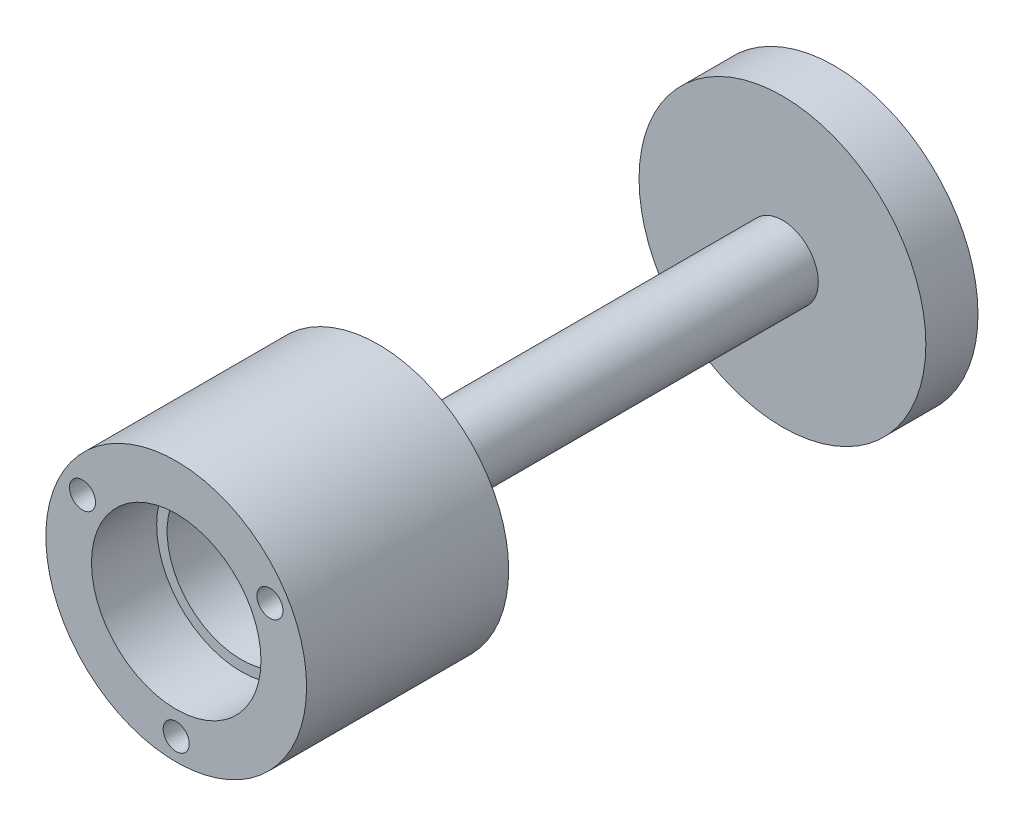
ISO-10303-21;
HEADER;
FILE_DESCRIPTION(('STEP AP214'),'2;1');
FILE_NAME('part.step','',(''),(''),'','','');
FILE_SCHEMA(('AUTOMOTIVE_DESIGN { 1 0 10303 214 1 1 1 1 }'));
ENDSEC;
DATA;
#1=APPLICATION_CONTEXT('core data for automotive mechanical design processes');
#2=APPLICATION_PROTOCOL_DEFINITION('international standard','automotive_design',2000,#1);
#3=PRODUCT_CONTEXT('',#1,'mechanical');
#4=PRODUCT('Part','Part','',(#3));
#5=PRODUCT_RELATED_PRODUCT_CATEGORY('part','',(#4));
#6=PRODUCT_DEFINITION_FORMATION('','',#4);
#7=PRODUCT_DEFINITION_CONTEXT('part definition',#1,'design');
#8=PRODUCT_DEFINITION('design','',#6,#7);
#9=PRODUCT_DEFINITION_SHAPE('','',#8);
#10=(LENGTH_UNIT() NAMED_UNIT(*) SI_UNIT(.MILLI.,.METRE.));
#11=(NAMED_UNIT(*) PLANE_ANGLE_UNIT() SI_UNIT($,.RADIAN.));
#12=(NAMED_UNIT(*) SI_UNIT($,.STERADIAN.) SOLID_ANGLE_UNIT());
#13=UNCERTAINTY_MEASURE_WITH_UNIT(LENGTH_MEASURE(1.E-05),#10,'distance_accuracy_value','');
#14=(GEOMETRIC_REPRESENTATION_CONTEXT(3) GLOBAL_UNCERTAINTY_ASSIGNED_CONTEXT((#13)) GLOBAL_UNIT_ASSIGNED_CONTEXT((#10,
#11,#12)) REPRESENTATION_CONTEXT('',''));
#15=CARTESIAN_POINT('',(0.,0.,0.));
#16=DIRECTION('',(0.,0.,1.));
#17=DIRECTION('',(1.,0.,0.));
#18=AXIS2_PLACEMENT_3D('',#15,#16,#17);
#19=CARTESIAN_POINT('',(0.,0.,31.01));
#20=DIRECTION('',(0.,0.,-1.));
#21=DIRECTION('',(-1.,0.,0.));
#22=AXIS2_PLACEMENT_3D('',#19,#20,#21);
#23=CYLINDRICAL_SURFACE('',#22,2.75);
#24=CARTESIAN_POINT('',(0.,0.,0.));
#25=DIRECTION('',(0.,0.,1.));
#26=DIRECTION('',(1.,0.,0.));
#27=AXIS2_PLACEMENT_3D('',#24,#25,#26);
#28=CIRCLE('',#27,2.75);
#29=CARTESIAN_POINT('',(2.75,0.,0.));
#30=VERTEX_POINT('',#29);
#31=EDGE_CURVE('E46',#30,#30,#28,.T.);
#32=ORIENTED_EDGE('',*,*,#31,.T.);
#33=EDGE_LOOP('',(#32));
#34=FACE_BOUND('',#33,.T.);
#35=CARTESIAN_POINT('',(0.,0.,31.));
#36=DIRECTION('',(0.,0.,1.));
#37=DIRECTION('',(1.,0.,0.));
#38=AXIS2_PLACEMENT_3D('',#35,#36,#37);
#39=CIRCLE('',#38,2.75);
#40=CARTESIAN_POINT('',(2.75,0.,31.));
#41=VERTEX_POINT('',#40);
#42=EDGE_CURVE('E10',#41,#41,#39,.T.);
#43=ORIENTED_EDGE('',*,*,#42,.F.);
#44=EDGE_LOOP('',(#43));
#45=FACE_BOUND('',#44,.T.);
#46=ADVANCED_FACE('F39',(#34,#45),#23,.T.);
#47=CARTESIAN_POINT('',(0.,0.,0.));
#48=DIRECTION('',(0.,0.,-1.));
#49=DIRECTION('',(-1.,0.,0.));
#50=AXIS2_PLACEMENT_3D('',#47,#48,#49);
#51=CYLINDRICAL_SURFACE('',#50,11.);
#52=CARTESIAN_POINT('',(0.,0.,0.));
#53=DIRECTION('',(0.,0.,1.));
#54=DIRECTION('',(1.,0.,0.));
#55=AXIS2_PLACEMENT_3D('',#52,#53,#54);
#56=CIRCLE('',#55,11.);
#57=CARTESIAN_POINT('',(11.,0.,0.));
#58=VERTEX_POINT('',#57);
#59=EDGE_CURVE('E49',#58,#58,#56,.T.);
#60=ORIENTED_EDGE('',*,*,#59,.F.);
#61=EDGE_LOOP('',(#60));
#62=FACE_BOUND('',#61,.T.);
#63=CARTESIAN_POINT('',(0.,0.,-4.));
#64=DIRECTION('',(0.,0.,1.));
#65=DIRECTION('',(1.,0.,0.));
#66=AXIS2_PLACEMENT_3D('',#63,#64,#65);
#67=CIRCLE('',#66,11.);
#68=CARTESIAN_POINT('',(11.,0.,-4.));
#69=VERTEX_POINT('',#68);
#70=EDGE_CURVE('E54',#69,#69,#67,.T.);
#71=ORIENTED_EDGE('',*,*,#70,.T.);
#72=EDGE_LOOP('',(#71));
#73=FACE_BOUND('',#72,.T.);
#74=ADVANCED_FACE('F41',(#62,#73),#51,.T.);
#75=CARTESIAN_POINT('',(0.,0.,0.));
#76=DIRECTION('',(0.,0.,1.));
#77=DIRECTION('',(1.,0.,0.));
#78=AXIS2_PLACEMENT_3D('',#75,#76,#77);
#79=PLANE('',#78);
#80=ORIENTED_EDGE('',*,*,#31,.F.);
#81=EDGE_LOOP('',(#80));
#82=FACE_BOUND('',#81,.T.);
#83=ORIENTED_EDGE('',*,*,#59,.T.);
#84=EDGE_LOOP('',(#83));
#85=FACE_BOUND('',#84,.T.);
#86=ADVANCED_FACE('F171',(#82,#85),#79,.T.);
#87=CARTESIAN_POINT('',(0.,0.,-4.));
#88=DIRECTION('',(0.,0.,1.));
#89=DIRECTION('',(1.,0.,0.));
#90=AXIS2_PLACEMENT_3D('',#87,#88,#89);
#91=PLANE('',#90);
#92=CARTESIAN_POINT('',(7.18801085141084,4.15,-4.));
#93=DIRECTION('',(0.,0.,-1.));
#94=DIRECTION('',(-1.,0.,0.));
#95=AXIS2_PLACEMENT_3D('',#92,#93,#94);
#96=CIRCLE('',#95,1.);
#97=CARTESIAN_POINT('',(6.18801085141084,4.15,-4.));
#98=VERTEX_POINT('',#97);
#99=EDGE_CURVE('E100',#98,#98,#96,.T.);
#100=ORIENTED_EDGE('',*,*,#99,.F.);
#101=EDGE_LOOP('',(#100));
#102=FACE_BOUND('',#101,.T.);
#103=CARTESIAN_POINT('',(-7.18801085141084,4.15,-4.));
#104=DIRECTION('',(0.,0.,-1.));
#105=DIRECTION('',(-1.,0.,0.));
#106=AXIS2_PLACEMENT_3D('',#103,#104,#105);
#107=CIRCLE('',#106,1.);
#108=CARTESIAN_POINT('',(-8.18801085141084,4.15,-4.));
#109=VERTEX_POINT('',#108);
#110=EDGE_CURVE('E94',#109,#109,#107,.T.);
#111=ORIENTED_EDGE('',*,*,#110,.F.);
#112=EDGE_LOOP('',(#111));
#113=FACE_BOUND('',#112,.T.);
#114=CARTESIAN_POINT('',(0.,-8.3,-4.));
#115=DIRECTION('',(0.,0.,-1.));
#116=DIRECTION('',(-1.,0.,0.));
#117=AXIS2_PLACEMENT_3D('',#114,#115,#116);
#118=CIRCLE('',#117,1.);
#119=CARTESIAN_POINT('',(-1.,-8.3,-4.));
#120=VERTEX_POINT('',#119);
#121=EDGE_CURVE('E87',#120,#120,#118,.T.);
#122=ORIENTED_EDGE('',*,*,#121,.F.);
#123=EDGE_LOOP('',(#122));
#124=FACE_BOUND('',#123,.T.);
#125=ORIENTED_EDGE('',*,*,#70,.F.);
#126=EDGE_LOOP('',(#125));
#127=FACE_BOUND('',#126,.T.);
#128=ADVANCED_FACE('F178',(#102,#113,#124,#127),#91,.F.);
#129=CARTESIAN_POINT('',(0.,0.,33.));
#130=DIRECTION('',(0.,0.,-1.));
#131=DIRECTION('',(-1.,0.,0.));
#132=AXIS2_PLACEMENT_3D('',#129,#130,#131);
#133=CYLINDRICAL_SURFACE('',#132,10.);
#134=CARTESIAN_POINT('',(0.,0.,31.));
#135=DIRECTION('',(0.,0.,1.));
#136=DIRECTION('',(1.,0.,0.));
#137=AXIS2_PLACEMENT_3D('',#134,#135,#136);
#138=CIRCLE('',#137,10.);
#139=CARTESIAN_POINT('',(10.,0.,31.));
#140=VERTEX_POINT('',#139);
#141=EDGE_CURVE('E59',#140,#140,#138,.T.);
#142=ORIENTED_EDGE('',*,*,#141,.T.);
#143=EDGE_LOOP('',(#142));
#144=FACE_BOUND('',#143,.T.);
#145=CARTESIAN_POINT('',(0.,0.,46.5));
#146=DIRECTION('',(0.,0.,1.));
#147=DIRECTION('',(1.,0.,0.));
#148=AXIS2_PLACEMENT_3D('',#145,#146,#147);
#149=CIRCLE('',#148,10.);
#150=CARTESIAN_POINT('',(10.,0.,46.5));
#151=VERTEX_POINT('',#150);
#152=EDGE_CURVE('E71',#151,#151,#149,.T.);
#153=ORIENTED_EDGE('',*,*,#152,.F.);
#154=EDGE_LOOP('',(#153));
#155=FACE_BOUND('',#154,.T.);
#156=ADVANCED_FACE('F177',(#144,#155),#133,.T.);
#157=CARTESIAN_POINT('',(0.,0.,31.));
#158=DIRECTION('',(0.,0.,1.));
#159=DIRECTION('',(1.,0.,0.));
#160=AXIS2_PLACEMENT_3D('',#157,#158,#159);
#161=PLANE('',#160);
#162=ORIENTED_EDGE('',*,*,#42,.T.);
#163=EDGE_LOOP('',(#162));
#164=FACE_BOUND('',#163,.T.);
#165=ORIENTED_EDGE('',*,*,#141,.F.);
#166=EDGE_LOOP('',(#165));
#167=FACE_BOUND('',#166,.T.);
#168=ADVANCED_FACE('F135',(#164,#167),#161,.F.);
#169=CARTESIAN_POINT('',(0.,0.,46.5));
#170=DIRECTION('',(0.,0.,1.));
#171=DIRECTION('',(1.,0.,0.));
#172=AXIS2_PLACEMENT_3D('',#169,#170,#171);
#173=PLANE('',#172);
#174=CARTESIAN_POINT('',(7.18801085141084,4.15,46.5));
#175=DIRECTION('',(0.,0.,1.));
#176=DIRECTION('',(1.,0.,0.));
#177=AXIS2_PLACEMENT_3D('',#174,#175,#176);
#178=CIRCLE('',#177,1.);
#179=CARTESIAN_POINT('',(8.18801085141084,4.15,46.5));
#180=VERTEX_POINT('',#179);
#181=EDGE_CURVE('E111',#180,#180,#178,.T.);
#182=ORIENTED_EDGE('',*,*,#181,.F.);
#183=EDGE_LOOP('',(#182));
#184=FACE_BOUND('',#183,.T.);
#185=CARTESIAN_POINT('',(-7.18801085141084,4.15,46.5));
#186=DIRECTION('',(0.,0.,1.));
#187=DIRECTION('',(1.,0.,0.));
#188=AXIS2_PLACEMENT_3D('',#185,#186,#187);
#189=CIRCLE('',#188,1.);
#190=CARTESIAN_POINT('',(-6.18801085141084,4.15,46.5));
#191=VERTEX_POINT('',#190);
#192=EDGE_CURVE('E112',#191,#191,#189,.T.);
#193=ORIENTED_EDGE('',*,*,#192,.F.);
#194=EDGE_LOOP('',(#193));
#195=FACE_BOUND('',#194,.T.);
#196=CARTESIAN_POINT('',(0.,-8.3,46.5));
#197=DIRECTION('',(0.,0.,1.));
#198=DIRECTION('',(1.,0.,0.));
#199=AXIS2_PLACEMENT_3D('',#196,#197,#198);
#200=CIRCLE('',#199,1.);
#201=CARTESIAN_POINT('',(0.999999999999999,-8.3,46.5));
#202=VERTEX_POINT('',#201);
#203=EDGE_CURVE('E104',#202,#202,#200,.T.);
#204=ORIENTED_EDGE('',*,*,#203,.F.);
#205=EDGE_LOOP('',(#204));
#206=FACE_BOUND('',#205,.T.);
#207=ORIENTED_EDGE('',*,*,#152,.T.);
#208=EDGE_LOOP('',(#207));
#209=FACE_BOUND('',#208,.T.);
#210=CARTESIAN_POINT('',(0.,0.,46.5));
#211=DIRECTION('',(0.,0.,1.));
#212=DIRECTION('',(1.,0.,0.));
#213=AXIS2_PLACEMENT_3D('',#210,#211,#212);
#214=CIRCLE('',#213,6.5);
#215=CARTESIAN_POINT('',(6.5,0.,46.5));
#216=VERTEX_POINT('',#215);
#217=EDGE_CURVE('E76',#216,#216,#214,.T.);
#218=ORIENTED_EDGE('',*,*,#217,.F.);
#219=EDGE_LOOP('',(#218));
#220=FACE_BOUND('',#219,.T.);
#221=ADVANCED_FACE('F129',(#184,#195,#206,#209,#220),#173,.T.);
#222=CARTESIAN_POINT('',(0.,0.,46.5));
#223=DIRECTION('',(0.,0.,-1.));
#224=DIRECTION('',(-1.,0.,0.));
#225=AXIS2_PLACEMENT_3D('',#222,#223,#224);
#226=CYLINDRICAL_SURFACE('',#225,6.5);
#227=ORIENTED_EDGE('',*,*,#217,.T.);
#228=EDGE_LOOP('',(#227));
#229=FACE_BOUND('',#228,.T.);
#230=CARTESIAN_POINT('',(0.,0.,41.5));
#231=DIRECTION('',(0.,0.,1.));
#232=DIRECTION('',(1.,0.,0.));
#233=AXIS2_PLACEMENT_3D('',#230,#231,#232);
#234=CIRCLE('',#233,6.5);
#235=CARTESIAN_POINT('',(6.5,0.,41.5));
#236=VERTEX_POINT('',#235);
#237=EDGE_CURVE('E80',#236,#236,#234,.T.);
#238=ORIENTED_EDGE('',*,*,#237,.F.);
#239=EDGE_LOOP('',(#238));
#240=FACE_BOUND('',#239,.T.);
#241=ADVANCED_FACE('F131',(#229,#240),#226,.F.);
#242=CARTESIAN_POINT('',(0.,0.,33.));
#243=DIRECTION('',(0.,0.,1.));
#244=DIRECTION('',(1.,0.,0.));
#245=AXIS2_PLACEMENT_3D('',#242,#243,#244);
#246=PLANE('',#245);
#247=CARTESIAN_POINT('',(0.,0.,33.));
#248=DIRECTION('',(0.,0.,1.));
#249=DIRECTION('',(1.,0.,0.));
#250=AXIS2_PLACEMENT_3D('',#247,#248,#249);
#251=CIRCLE('',#250,5.7);
#252=CARTESIAN_POINT('',(5.7,0.,33.));
#253=VERTEX_POINT('',#252);
#254=EDGE_CURVE('E69',#253,#253,#251,.T.);
#255=ORIENTED_EDGE('',*,*,#254,.T.);
#256=EDGE_LOOP('',(#255));
#257=FACE_BOUND('',#256,.T.);
#258=ADVANCED_FACE('F144',(#257),#246,.T.);
#259=CARTESIAN_POINT('',(0.,0.,41.5));
#260=DIRECTION('',(0.,0.,-1.));
#261=DIRECTION('',(-1.,0.,0.));
#262=AXIS2_PLACEMENT_3D('',#259,#260,#261);
#263=CYLINDRICAL_SURFACE('',#262,5.7);
#264=CARTESIAN_POINT('',(0.,0.,41.5));
#265=DIRECTION('',(0.,0.,1.));
#266=DIRECTION('',(1.,0.,0.));
#267=AXIS2_PLACEMENT_3D('',#264,#265,#266);
#268=CIRCLE('',#267,5.7);
#269=CARTESIAN_POINT('',(5.7,0.,41.5));
#270=VERTEX_POINT('',#269);
#271=EDGE_CURVE('E63',#270,#270,#268,.T.);
#272=ORIENTED_EDGE('',*,*,#271,.T.);
#273=EDGE_LOOP('',(#272));
#274=FACE_BOUND('',#273,.T.);
#275=ORIENTED_EDGE('',*,*,#254,.F.);
#276=EDGE_LOOP('',(#275));
#277=FACE_BOUND('',#276,.T.);
#278=ADVANCED_FACE('F155',(#274,#277),#263,.F.);
#279=CARTESIAN_POINT('',(0.,0.,41.5));
#280=DIRECTION('',(0.,0.,1.));
#281=DIRECTION('',(1.,0.,0.));
#282=AXIS2_PLACEMENT_3D('',#279,#280,#281);
#283=PLANE('',#282);
#284=ORIENTED_EDGE('',*,*,#271,.F.);
#285=EDGE_LOOP('',(#284));
#286=FACE_BOUND('',#285,.T.);
#287=ORIENTED_EDGE('',*,*,#237,.T.);
#288=EDGE_LOOP('',(#287));
#289=FACE_BOUND('',#288,.T.);
#290=ADVANCED_FACE('F149',(#286,#289),#283,.T.);
#291=CARTESIAN_POINT('',(0.,-8.3,-0.4));
#292=DIRECTION('',(0.,0.,-1.));
#293=DIRECTION('',(-1.,0.,0.));
#294=AXIS2_PLACEMENT_3D('',#291,#292,#293);
#295=CYLINDRICAL_SURFACE('',#294,1.);
#296=CARTESIAN_POINT('',(0.,-8.3,-0.4));
#297=DIRECTION('',(0.,0.,-1.));
#298=DIRECTION('',(-1.,0.,0.));
#299=AXIS2_PLACEMENT_3D('',#296,#297,#298);
#300=CIRCLE('',#299,1.);
#301=CARTESIAN_POINT('',(-1.,-8.3,-0.4));
#302=VERTEX_POINT('',#301);
#303=EDGE_CURVE('E83',#302,#302,#300,.T.);
#304=ORIENTED_EDGE('',*,*,#303,.F.);
#305=EDGE_LOOP('',(#304));
#306=FACE_BOUND('',#305,.T.);
#307=ORIENTED_EDGE('',*,*,#121,.T.);
#308=EDGE_LOOP('',(#307));
#309=FACE_BOUND('',#308,.T.);
#310=ADVANCED_FACE('F151',(#306,#309),#295,.F.);
#311=CARTESIAN_POINT('',(0.,-8.3,-0.4));
#312=DIRECTION('',(0.,0.,-1.));
#313=DIRECTION('',(-1.,0.,0.));
#314=AXIS2_PLACEMENT_3D('',#311,#312,#313);
#315=PLANE('',#314);
#316=ORIENTED_EDGE('',*,*,#303,.T.);
#317=EDGE_LOOP('',(#316));
#318=FACE_BOUND('',#317,.T.);
#319=ADVANCED_FACE('F157',(#318),#315,.T.);
#320=CARTESIAN_POINT('',(-7.18801085141084,4.15,-0.4));
#321=DIRECTION('',(0.,0.,-1.));
#322=DIRECTION('',(-1.,0.,0.));
#323=AXIS2_PLACEMENT_3D('',#320,#321,#322);
#324=CYLINDRICAL_SURFACE('',#323,1.);
#325=CARTESIAN_POINT('',(-7.18801085141084,4.15,-0.4));
#326=DIRECTION('',(0.,0.,-1.));
#327=DIRECTION('',(-1.,0.,0.));
#328=AXIS2_PLACEMENT_3D('',#325,#326,#327);
#329=CIRCLE('',#328,1.);
#330=CARTESIAN_POINT('',(-8.18801085141084,4.15,-0.4));
#331=VERTEX_POINT('',#330);
#332=EDGE_CURVE('E93',#331,#331,#329,.T.);
#333=ORIENTED_EDGE('',*,*,#332,.F.);
#334=EDGE_LOOP('',(#333));
#335=FACE_BOUND('',#334,.T.);
#336=ORIENTED_EDGE('',*,*,#110,.T.);
#337=EDGE_LOOP('',(#336));
#338=FACE_BOUND('',#337,.T.);
#339=ADVANCED_FACE('F194',(#335,#338),#324,.F.);
#340=CARTESIAN_POINT('',(-7.18801085141084,4.15,-0.4));
#341=DIRECTION('',(0.,0.,-1.));
#342=DIRECTION('',(-1.,0.,0.));
#343=AXIS2_PLACEMENT_3D('',#340,#341,#342);
#344=PLANE('',#343);
#345=ORIENTED_EDGE('',*,*,#332,.T.);
#346=EDGE_LOOP('',(#345));
#347=FACE_BOUND('',#346,.T.);
#348=ADVANCED_FACE('F195',(#347),#344,.T.);
#349=CARTESIAN_POINT('',(7.18801085141084,4.15,-0.4));
#350=DIRECTION('',(0.,0.,-1.));
#351=DIRECTION('',(-1.,0.,0.));
#352=AXIS2_PLACEMENT_3D('',#349,#350,#351);
#353=CYLINDRICAL_SURFACE('',#352,1.);
#354=CARTESIAN_POINT('',(7.18801085141084,4.15,-0.4));
#355=DIRECTION('',(0.,0.,-1.));
#356=DIRECTION('',(-1.,0.,0.));
#357=AXIS2_PLACEMENT_3D('',#354,#355,#356);
#358=CIRCLE('',#357,1.);
#359=CARTESIAN_POINT('',(6.18801085141084,4.15,-0.4));
#360=VERTEX_POINT('',#359);
#361=EDGE_CURVE('E81',#360,#360,#358,.T.);
#362=ORIENTED_EDGE('',*,*,#361,.F.);
#363=EDGE_LOOP('',(#362));
#364=FACE_BOUND('',#363,.T.);
#365=ORIENTED_EDGE('',*,*,#99,.T.);
#366=EDGE_LOOP('',(#365));
#367=FACE_BOUND('',#366,.T.);
#368=ADVANCED_FACE('F205',(#364,#367),#353,.F.);
#369=CARTESIAN_POINT('',(7.18801085141084,4.15,-0.4));
#370=DIRECTION('',(0.,0.,-1.));
#371=DIRECTION('',(-1.,0.,0.));
#372=AXIS2_PLACEMENT_3D('',#369,#370,#371);
#373=PLANE('',#372);
#374=ORIENTED_EDGE('',*,*,#361,.T.);
#375=EDGE_LOOP('',(#374));
#376=FACE_BOUND('',#375,.T.);
#377=ADVANCED_FACE('F211',(#376),#373,.T.);
#378=CARTESIAN_POINT('',(0.,-8.3,42.2));
#379=DIRECTION('',(0.,0.,1.));
#380=DIRECTION('',(1.,0.,0.));
#381=AXIS2_PLACEMENT_3D('',#378,#379,#380);
#382=CYLINDRICAL_SURFACE('',#381,1.);
#383=CARTESIAN_POINT('',(0.,-8.3,42.2));
#384=DIRECTION('',(0.,0.,1.));
#385=DIRECTION('',(1.,0.,0.));
#386=AXIS2_PLACEMENT_3D('',#383,#384,#385);
#387=CIRCLE('',#386,1.);
#388=CARTESIAN_POINT('',(0.999999999999999,-8.3,42.2));
#389=VERTEX_POINT('',#388);
#390=EDGE_CURVE('E105',#389,#389,#387,.T.);
#391=CARTESIAN_POINT('',(0.999999999999999,-8.3,42.2));
#392=CARTESIAN_POINT('',(0.999999999999999,-8.3,42.2447916666667));
#393=CARTESIAN_POINT('',(0.999999999999999,-8.3,42.2895833333333));
#394=CARTESIAN_POINT('',(0.999999999999999,-8.3,42.3791666666667));
#395=CARTESIAN_POINT('',(0.999999999999999,-8.3,42.4239583333333));
#396=CARTESIAN_POINT('',(0.999999999999999,-8.3,42.5135416666667));
#397=CARTESIAN_POINT('',(0.999999999999999,-8.3,42.5583333333333));
#398=CARTESIAN_POINT('',(0.999999999999999,-8.3,42.6479166666667));
#399=CARTESIAN_POINT('',(0.999999999999999,-8.3,42.6927083333333));
#400=CARTESIAN_POINT('',(0.999999999999999,-8.3,42.7822916666667));
#401=CARTESIAN_POINT('',(0.999999999999999,-8.3,42.8270833333333));
#402=CARTESIAN_POINT('',(0.999999999999999,-8.3,42.9166666666667));
#403=CARTESIAN_POINT('',(0.999999999999999,-8.3,42.9614583333333));
#404=CARTESIAN_POINT('',(0.999999999999999,-8.3,43.0510416666667));
#405=CARTESIAN_POINT('',(0.999999999999999,-8.3,43.0958333333333));
#406=CARTESIAN_POINT('',(0.999999999999999,-8.3,43.1854166666667));
#407=CARTESIAN_POINT('',(0.999999999999999,-8.3,43.2302083333333));
#408=CARTESIAN_POINT('',(0.999999999999999,-8.3,43.3197916666667));
#409=CARTESIAN_POINT('',(0.999999999999999,-8.3,43.3645833333333));
#410=CARTESIAN_POINT('',(0.999999999999999,-8.3,43.4541666666667));
#411=CARTESIAN_POINT('',(0.999999999999999,-8.3,43.4989583333333));
#412=CARTESIAN_POINT('',(0.999999999999999,-8.3,43.5885416666667));
#413=CARTESIAN_POINT('',(0.999999999999999,-8.3,43.6333333333333));
#414=CARTESIAN_POINT('',(0.999999999999999,-8.3,43.7229166666667));
#415=CARTESIAN_POINT('',(0.999999999999999,-8.3,43.7677083333333));
#416=CARTESIAN_POINT('',(0.999999999999999,-8.3,43.8572916666667));
#417=CARTESIAN_POINT('',(0.999999999999999,-8.3,43.9020833333333));
#418=CARTESIAN_POINT('',(0.999999999999999,-8.3,43.9916666666667));
#419=CARTESIAN_POINT('',(0.999999999999999,-8.3,44.0364583333333));
#420=CARTESIAN_POINT('',(0.999999999999999,-8.3,44.1260416666667));
#421=CARTESIAN_POINT('',(0.999999999999999,-8.3,44.1708333333333));
#422=CARTESIAN_POINT('',(0.999999999999999,-8.3,44.2604166666667));
#423=CARTESIAN_POINT('',(0.999999999999999,-8.3,44.3052083333333));
#424=CARTESIAN_POINT('',(0.999999999999999,-8.3,44.3947916666667));
#425=CARTESIAN_POINT('',(0.999999999999999,-8.3,44.4395833333333));
#426=CARTESIAN_POINT('',(0.999999999999999,-8.3,44.5291666666667));
#427=CARTESIAN_POINT('',(0.999999999999999,-8.3,44.5739583333333));
#428=CARTESIAN_POINT('',(0.999999999999999,-8.3,44.6635416666667));
#429=CARTESIAN_POINT('',(0.999999999999999,-8.3,44.7083333333333));
#430=CARTESIAN_POINT('',(0.999999999999999,-8.3,44.7979166666667));
#431=CARTESIAN_POINT('',(0.999999999999999,-8.3,44.8427083333333));
#432=CARTESIAN_POINT('',(0.999999999999999,-8.3,44.9322916666667));
#433=CARTESIAN_POINT('',(0.999999999999999,-8.3,44.9770833333333));
#434=CARTESIAN_POINT('',(0.999999999999999,-8.3,45.0666666666667));
#435=CARTESIAN_POINT('',(0.999999999999999,-8.3,45.1114583333333));
#436=CARTESIAN_POINT('',(0.999999999999999,-8.3,45.2010416666667));
#437=CARTESIAN_POINT('',(0.999999999999999,-8.3,45.2458333333333));
#438=CARTESIAN_POINT('',(0.999999999999999,-8.3,45.3354166666667));
#439=CARTESIAN_POINT('',(0.999999999999999,-8.3,45.3802083333333));
#440=CARTESIAN_POINT('',(0.999999999999999,-8.3,45.4697916666667));
#441=CARTESIAN_POINT('',(0.999999999999999,-8.3,45.5145833333333));
#442=CARTESIAN_POINT('',(0.999999999999999,-8.3,45.6041666666667));
#443=CARTESIAN_POINT('',(0.999999999999999,-8.3,45.6489583333333));
#444=CARTESIAN_POINT('',(0.999999999999999,-8.3,45.7385416666667));
#445=CARTESIAN_POINT('',(0.999999999999999,-8.3,45.7833333333333));
#446=CARTESIAN_POINT('',(0.999999999999999,-8.3,45.8729166666667));
#447=CARTESIAN_POINT('',(0.999999999999999,-8.3,45.9177083333333));
#448=CARTESIAN_POINT('',(0.999999999999999,-8.3,46.0072916666667));
#449=CARTESIAN_POINT('',(0.999999999999999,-8.3,46.0520833333333));
#450=CARTESIAN_POINT('',(0.999999999999999,-8.3,46.1416666666667));
#451=CARTESIAN_POINT('',(0.999999999999999,-8.3,46.1864583333333));
#452=CARTESIAN_POINT('',(0.999999999999999,-8.3,46.2760416666667));
#453=CARTESIAN_POINT('',(0.999999999999999,-8.3,46.3208333333333));
#454=CARTESIAN_POINT('',(0.999999999999999,-8.3,46.4104166666667));
#455=CARTESIAN_POINT('',(0.999999999999999,-8.3,46.4552083333333));
#456=CARTESIAN_POINT('',(0.999999999999999,-8.3,46.5));
#457=B_SPLINE_CURVE_WITH_KNOTS('',3,(#391,#392,#393,#394,#395,#396,#397,#398,#399,#400,#401,
#402,#403,#404,#405,#406,#407,#408,#409,#410,#411,#412,#413,#414,#415,#416,#417,#418,#419,#420,
#421,#422,#423,#424,#425,#426,#427,#428,#429,#430,#431,#432,#433,#434,#435,#436,#437,#438,#439,
#440,#441,#442,#443,#444,#445,#446,#447,#448,#449,#450,#451,#452,#453,#454,#455,#456),
.UNSPECIFIED.,.F.,.F.,(4,2,2,2,2,2,2,2,2,2,2,2,2,2,2,2,2,2,2,2,2,2,2,2,2,2,2,2,2,2,2,2,4),(0.,
0.134375000000006,0.268750000000005,0.403125000000004,0.537500000000003,0.671875000000002,
0.806250000000001,0.940625,1.075,1.20937500000001,1.34375,1.478125,1.6125,1.746875,1.88125,
2.015625,2.15,2.28437500000001,2.41875,2.553125,2.6875,2.821875,2.95625,3.090625,3.225,3.359375,
3.49375,3.628125,3.7625,3.896875,4.03125,4.165625,4.3),.UNSPECIFIED.);
#458=EDGE_CURVE('BSEAM214',#389,#202,#457,.T.);
#459=ORIENTED_EDGE('',*,*,#390,.F.);
#460=ORIENTED_EDGE('',*,*,#203,.T.);
#461=ORIENTED_EDGE('',*,*,#458,.T.);
#462=ORIENTED_EDGE('',*,*,#458,.F.);
#463=EDGE_LOOP('',(#459,#461,#460,#462));
#464=FACE_BOUND('',#463,.T.);
#465=ADVANCED_FACE('F214',(#464),#382,.F.);
#466=CARTESIAN_POINT('',(0.,-8.3,42.2));
#467=DIRECTION('',(0.,0.,1.));
#468=DIRECTION('',(1.,0.,0.));
#469=AXIS2_PLACEMENT_3D('',#466,#467,#468);
#470=PLANE('',#469);
#471=ORIENTED_EDGE('',*,*,#390,.T.);
#472=EDGE_LOOP('',(#471));
#473=FACE_BOUND('',#472,.T.);
#474=ADVANCED_FACE('F220',(#473),#470,.T.);
#475=CARTESIAN_POINT('',(-7.18801085141084,4.15,42.2));
#476=DIRECTION('',(0.,0.,1.));
#477=DIRECTION('',(1.,0.,0.));
#478=AXIS2_PLACEMENT_3D('',#475,#476,#477);
#479=CYLINDRICAL_SURFACE('',#478,1.);
#480=CARTESIAN_POINT('',(-7.18801085141084,4.15,42.2));
#481=DIRECTION('',(0.,0.,1.));
#482=DIRECTION('',(1.,0.,0.));
#483=AXIS2_PLACEMENT_3D('',#480,#481,#482);
#484=CIRCLE('',#483,1.);
#485=CARTESIAN_POINT('',(-6.18801085141084,4.15,42.2));
#486=VERTEX_POINT('',#485);
#487=EDGE_CURVE('E107',#486,#486,#484,.T.);
#488=CARTESIAN_POINT('',(-6.18801085141084,4.15,42.2));
#489=CARTESIAN_POINT('',(-6.18801085141084,4.15,42.2447916666667));
#490=CARTESIAN_POINT('',(-6.18801085141084,4.15,42.2895833333333));
#491=CARTESIAN_POINT('',(-6.18801085141084,4.15,42.3791666666667));
#492=CARTESIAN_POINT('',(-6.18801085141084,4.15,42.4239583333333));
#493=CARTESIAN_POINT('',(-6.18801085141084,4.15,42.5135416666667));
#494=CARTESIAN_POINT('',(-6.18801085141084,4.15,42.5583333333333));
#495=CARTESIAN_POINT('',(-6.18801085141084,4.15,42.6479166666667));
#496=CARTESIAN_POINT('',(-6.18801085141084,4.15,42.6927083333333));
#497=CARTESIAN_POINT('',(-6.18801085141084,4.15,42.7822916666667));
#498=CARTESIAN_POINT('',(-6.18801085141084,4.15,42.8270833333333));
#499=CARTESIAN_POINT('',(-6.18801085141084,4.15,42.9166666666667));
#500=CARTESIAN_POINT('',(-6.18801085141084,4.15,42.9614583333333));
#501=CARTESIAN_POINT('',(-6.18801085141084,4.15,43.0510416666667));
#502=CARTESIAN_POINT('',(-6.18801085141084,4.15,43.0958333333333));
#503=CARTESIAN_POINT('',(-6.18801085141084,4.15,43.1854166666667));
#504=CARTESIAN_POINT('',(-6.18801085141084,4.15,43.2302083333333));
#505=CARTESIAN_POINT('',(-6.18801085141084,4.15,43.3197916666667));
#506=CARTESIAN_POINT('',(-6.18801085141084,4.15,43.3645833333333));
#507=CARTESIAN_POINT('',(-6.18801085141084,4.15,43.4541666666667));
#508=CARTESIAN_POINT('',(-6.18801085141084,4.15,43.4989583333333));
#509=CARTESIAN_POINT('',(-6.18801085141084,4.15,43.5885416666667));
#510=CARTESIAN_POINT('',(-6.18801085141084,4.15,43.6333333333333));
#511=CARTESIAN_POINT('',(-6.18801085141084,4.15,43.7229166666667));
#512=CARTESIAN_POINT('',(-6.18801085141084,4.15,43.7677083333333));
#513=CARTESIAN_POINT('',(-6.18801085141084,4.15,43.8572916666667));
#514=CARTESIAN_POINT('',(-6.18801085141084,4.15,43.9020833333333));
#515=CARTESIAN_POINT('',(-6.18801085141084,4.15,43.9916666666667));
#516=CARTESIAN_POINT('',(-6.18801085141084,4.15,44.0364583333333));
#517=CARTESIAN_POINT('',(-6.18801085141084,4.15,44.1260416666667));
#518=CARTESIAN_POINT('',(-6.18801085141084,4.15,44.1708333333333));
#519=CARTESIAN_POINT('',(-6.18801085141084,4.15,44.2604166666667));
#520=CARTESIAN_POINT('',(-6.18801085141084,4.15,44.3052083333333));
#521=CARTESIAN_POINT('',(-6.18801085141084,4.15,44.3947916666667));
#522=CARTESIAN_POINT('',(-6.18801085141084,4.15,44.4395833333333));
#523=CARTESIAN_POINT('',(-6.18801085141084,4.15,44.5291666666667));
#524=CARTESIAN_POINT('',(-6.18801085141084,4.15,44.5739583333333));
#525=CARTESIAN_POINT('',(-6.18801085141084,4.15,44.6635416666667));
#526=CARTESIAN_POINT('',(-6.18801085141084,4.15,44.7083333333333));
#527=CARTESIAN_POINT('',(-6.18801085141084,4.15,44.7979166666667));
#528=CARTESIAN_POINT('',(-6.18801085141084,4.15,44.8427083333333));
#529=CARTESIAN_POINT('',(-6.18801085141084,4.15,44.9322916666667));
#530=CARTESIAN_POINT('',(-6.18801085141084,4.15,44.9770833333333));
#531=CARTESIAN_POINT('',(-6.18801085141084,4.15,45.0666666666667));
#532=CARTESIAN_POINT('',(-6.18801085141084,4.15,45.1114583333333));
#533=CARTESIAN_POINT('',(-6.18801085141084,4.15,45.2010416666667));
#534=CARTESIAN_POINT('',(-6.18801085141084,4.15,45.2458333333333));
#535=CARTESIAN_POINT('',(-6.18801085141084,4.15,45.3354166666667));
#536=CARTESIAN_POINT('',(-6.18801085141084,4.15,45.3802083333333));
#537=CARTESIAN_POINT('',(-6.18801085141084,4.15,45.4697916666667));
#538=CARTESIAN_POINT('',(-6.18801085141084,4.15,45.5145833333333));
#539=CARTESIAN_POINT('',(-6.18801085141084,4.15,45.6041666666667));
#540=CARTESIAN_POINT('',(-6.18801085141084,4.15,45.6489583333333));
#541=CARTESIAN_POINT('',(-6.18801085141084,4.15,45.7385416666667));
#542=CARTESIAN_POINT('',(-6.18801085141084,4.15,45.7833333333333));
#543=CARTESIAN_POINT('',(-6.18801085141084,4.15,45.8729166666667));
#544=CARTESIAN_POINT('',(-6.18801085141084,4.15,45.9177083333333));
#545=CARTESIAN_POINT('',(-6.18801085141084,4.15,46.0072916666667));
#546=CARTESIAN_POINT('',(-6.18801085141084,4.15,46.0520833333333));
#547=CARTESIAN_POINT('',(-6.18801085141084,4.15,46.1416666666667));
#548=CARTESIAN_POINT('',(-6.18801085141084,4.15,46.1864583333333));
#549=CARTESIAN_POINT('',(-6.18801085141084,4.15,46.2760416666667));
#550=CARTESIAN_POINT('',(-6.18801085141084,4.15,46.3208333333333));
#551=CARTESIAN_POINT('',(-6.18801085141084,4.15,46.4104166666667));
#552=CARTESIAN_POINT('',(-6.18801085141084,4.15,46.4552083333333));
#553=CARTESIAN_POINT('',(-6.18801085141084,4.15,46.5));
#554=B_SPLINE_CURVE_WITH_KNOTS('',3,(#488,#489,#490,#491,#492,#493,#494,#495,#496,#497,#498,
#499,#500,#501,#502,#503,#504,#505,#506,#507,#508,#509,#510,#511,#512,#513,#514,#515,#516,#517,
#518,#519,#520,#521,#522,#523,#524,#525,#526,#527,#528,#529,#530,#531,#532,#533,#534,#535,#536,
#537,#538,#539,#540,#541,#542,#543,#544,#545,#546,#547,#548,#549,#550,#551,#552,#553),
.UNSPECIFIED.,.F.,.F.,(4,2,2,2,2,2,2,2,2,2,2,2,2,2,2,2,2,2,2,2,2,2,2,2,2,2,2,2,2,2,2,2,4),(0.,
0.134375000000006,0.268750000000005,0.403125000000004,0.537500000000003,0.671875000000002,
0.806250000000001,0.940625,1.075,1.20937500000001,1.34375,1.478125,1.6125,1.746875,1.88125,
2.015625,2.15,2.28437500000001,2.41875,2.553125,2.6875,2.821875,2.95625,3.090625,3.225,3.359375,
3.49375,3.628125,3.7625,3.896875,4.03125,4.165625,4.3),.UNSPECIFIED.);
#555=EDGE_CURVE('BSEAM219',#486,#191,#554,.T.);
#556=ORIENTED_EDGE('',*,*,#487,.F.);
#557=ORIENTED_EDGE('',*,*,#192,.T.);
#558=ORIENTED_EDGE('',*,*,#555,.T.);
#559=ORIENTED_EDGE('',*,*,#555,.F.);
#560=EDGE_LOOP('',(#556,#558,#557,#559));
#561=FACE_BOUND('',#560,.T.);
#562=ADVANCED_FACE('F219',(#561),#479,.F.);
#563=CARTESIAN_POINT('',(-7.18801085141084,4.15,42.2));
#564=DIRECTION('',(0.,0.,1.));
#565=DIRECTION('',(1.,0.,0.));
#566=AXIS2_PLACEMENT_3D('',#563,#564,#565);
#567=PLANE('',#566);
#568=ORIENTED_EDGE('',*,*,#487,.T.);
#569=EDGE_LOOP('',(#568));
#570=FACE_BOUND('',#569,.T.);
#571=ADVANCED_FACE('F125',(#570),#567,.T.);
#572=CARTESIAN_POINT('',(7.18801085141084,4.15,42.2));
#573=DIRECTION('',(0.,0.,1.));
#574=DIRECTION('',(1.,0.,0.));
#575=AXIS2_PLACEMENT_3D('',#572,#573,#574);
#576=CYLINDRICAL_SURFACE('',#575,1.);
#577=CARTESIAN_POINT('',(7.18801085141084,4.15,42.2));
#578=DIRECTION('',(0.,0.,1.));
#579=DIRECTION('',(1.,0.,0.));
#580=AXIS2_PLACEMENT_3D('',#577,#578,#579);
#581=CIRCLE('',#580,1.);
#582=CARTESIAN_POINT('',(8.18801085141084,4.15,42.2));
#583=VERTEX_POINT('',#582);
#584=EDGE_CURVE('E86',#583,#583,#581,.T.);
#585=CARTESIAN_POINT('',(8.18801085141084,4.15,42.2));
#586=CARTESIAN_POINT('',(8.18801085141084,4.15,42.2447916666667));
#587=CARTESIAN_POINT('',(8.18801085141084,4.15,42.2895833333333));
#588=CARTESIAN_POINT('',(8.18801085141084,4.15,42.3791666666667));
#589=CARTESIAN_POINT('',(8.18801085141084,4.15,42.4239583333333));
#590=CARTESIAN_POINT('',(8.18801085141084,4.15,42.5135416666667));
#591=CARTESIAN_POINT('',(8.18801085141084,4.15,42.5583333333333));
#592=CARTESIAN_POINT('',(8.18801085141084,4.15,42.6479166666667));
#593=CARTESIAN_POINT('',(8.18801085141084,4.15,42.6927083333333));
#594=CARTESIAN_POINT('',(8.18801085141084,4.15,42.7822916666667));
#595=CARTESIAN_POINT('',(8.18801085141084,4.15,42.8270833333333));
#596=CARTESIAN_POINT('',(8.18801085141084,4.15,42.9166666666667));
#597=CARTESIAN_POINT('',(8.18801085141084,4.15,42.9614583333333));
#598=CARTESIAN_POINT('',(8.18801085141084,4.15,43.0510416666667));
#599=CARTESIAN_POINT('',(8.18801085141084,4.15,43.0958333333333));
#600=CARTESIAN_POINT('',(8.18801085141084,4.15,43.1854166666667));
#601=CARTESIAN_POINT('',(8.18801085141084,4.15,43.2302083333333));
#602=CARTESIAN_POINT('',(8.18801085141084,4.15,43.3197916666667));
#603=CARTESIAN_POINT('',(8.18801085141084,4.15,43.3645833333333));
#604=CARTESIAN_POINT('',(8.18801085141084,4.15,43.4541666666667));
#605=CARTESIAN_POINT('',(8.18801085141084,4.15,43.4989583333333));
#606=CARTESIAN_POINT('',(8.18801085141084,4.15,43.5885416666667));
#607=CARTESIAN_POINT('',(8.18801085141084,4.15,43.6333333333333));
#608=CARTESIAN_POINT('',(8.18801085141084,4.15,43.7229166666667));
#609=CARTESIAN_POINT('',(8.18801085141084,4.15,43.7677083333333));
#610=CARTESIAN_POINT('',(8.18801085141084,4.15,43.8572916666667));
#611=CARTESIAN_POINT('',(8.18801085141084,4.15,43.9020833333333));
#612=CARTESIAN_POINT('',(8.18801085141084,4.15,43.9916666666667));
#613=CARTESIAN_POINT('',(8.18801085141084,4.15,44.0364583333333));
#614=CARTESIAN_POINT('',(8.18801085141084,4.15,44.1260416666667));
#615=CARTESIAN_POINT('',(8.18801085141084,4.15,44.1708333333333));
#616=CARTESIAN_POINT('',(8.18801085141084,4.15,44.2604166666667));
#617=CARTESIAN_POINT('',(8.18801085141084,4.15,44.3052083333333));
#618=CARTESIAN_POINT('',(8.18801085141084,4.15,44.3947916666667));
#619=CARTESIAN_POINT('',(8.18801085141084,4.15,44.4395833333333));
#620=CARTESIAN_POINT('',(8.18801085141084,4.15,44.5291666666667));
#621=CARTESIAN_POINT('',(8.18801085141084,4.15,44.5739583333333));
#622=CARTESIAN_POINT('',(8.18801085141084,4.15,44.6635416666667));
#623=CARTESIAN_POINT('',(8.18801085141084,4.15,44.7083333333333));
#624=CARTESIAN_POINT('',(8.18801085141084,4.15,44.7979166666667));
#625=CARTESIAN_POINT('',(8.18801085141084,4.15,44.8427083333333));
#626=CARTESIAN_POINT('',(8.18801085141084,4.15,44.9322916666667));
#627=CARTESIAN_POINT('',(8.18801085141084,4.15,44.9770833333333));
#628=CARTESIAN_POINT('',(8.18801085141084,4.15,45.0666666666667));
#629=CARTESIAN_POINT('',(8.18801085141084,4.15,45.1114583333333));
#630=CARTESIAN_POINT('',(8.18801085141084,4.15,45.2010416666667));
#631=CARTESIAN_POINT('',(8.18801085141084,4.15,45.2458333333333));
#632=CARTESIAN_POINT('',(8.18801085141084,4.15,45.3354166666667));
#633=CARTESIAN_POINT('',(8.18801085141084,4.15,45.3802083333333));
#634=CARTESIAN_POINT('',(8.18801085141084,4.15,45.4697916666667));
#635=CARTESIAN_POINT('',(8.18801085141084,4.15,45.5145833333333));
#636=CARTESIAN_POINT('',(8.18801085141084,4.15,45.6041666666667));
#637=CARTESIAN_POINT('',(8.18801085141084,4.15,45.6489583333333));
#638=CARTESIAN_POINT('',(8.18801085141084,4.15,45.7385416666667));
#639=CARTESIAN_POINT('',(8.18801085141084,4.15,45.7833333333333));
#640=CARTESIAN_POINT('',(8.18801085141084,4.15,45.8729166666667));
#641=CARTESIAN_POINT('',(8.18801085141084,4.15,45.9177083333333));
#642=CARTESIAN_POINT('',(8.18801085141084,4.15,46.0072916666667));
#643=CARTESIAN_POINT('',(8.18801085141084,4.15,46.0520833333333));
#644=CARTESIAN_POINT('',(8.18801085141084,4.15,46.1416666666667));
#645=CARTESIAN_POINT('',(8.18801085141084,4.15,46.1864583333333));
#646=CARTESIAN_POINT('',(8.18801085141084,4.15,46.2760416666667));
#647=CARTESIAN_POINT('',(8.18801085141084,4.15,46.3208333333333));
#648=CARTESIAN_POINT('',(8.18801085141084,4.15,46.4104166666667));
#649=CARTESIAN_POINT('',(8.18801085141084,4.15,46.4552083333333));
#650=CARTESIAN_POINT('',(8.18801085141084,4.15,46.5));
#651=B_SPLINE_CURVE_WITH_KNOTS('',3,(#585,#586,#587,#588,#589,#590,#591,#592,#593,#594,#595,
#596,#597,#598,#599,#600,#601,#602,#603,#604,#605,#606,#607,#608,#609,#610,#611,#612,#613,#614,
#615,#616,#617,#618,#619,#620,#621,#622,#623,#624,#625,#626,#627,#628,#629,#630,#631,#632,#633,
#634,#635,#636,#637,#638,#639,#640,#641,#642,#643,#644,#645,#646,#647,#648,#649,#650),
.UNSPECIFIED.,.F.,.F.,(4,2,2,2,2,2,2,2,2,2,2,2,2,2,2,2,2,2,2,2,2,2,2,2,2,2,2,2,2,2,2,2,4),(0.,
0.134375000000006,0.268750000000005,0.403125000000004,0.537500000000003,0.671875000000002,
0.806250000000001,0.940625,1.075,1.20937500000001,1.34375,1.478125,1.6125,1.746875,1.88125,
2.015625,2.15,2.28437500000001,2.41875,2.553125,2.6875,2.821875,2.95625,3.090625,3.225,3.359375,
3.49375,3.628125,3.7625,3.896875,4.03125,4.165625,4.3),.UNSPECIFIED.);
#652=EDGE_CURVE('BSEAM122',#583,#180,#651,.T.);
#653=ORIENTED_EDGE('',*,*,#584,.F.);
#654=ORIENTED_EDGE('',*,*,#181,.T.);
#655=ORIENTED_EDGE('',*,*,#652,.T.);
#656=ORIENTED_EDGE('',*,*,#652,.F.);
#657=EDGE_LOOP('',(#653,#655,#654,#656));
#658=FACE_BOUND('',#657,.T.);
#659=ADVANCED_FACE('F122',(#658),#576,.F.);
#660=CARTESIAN_POINT('',(7.18801085141084,4.15,42.2));
#661=DIRECTION('',(0.,0.,1.));
#662=DIRECTION('',(1.,0.,0.));
#663=AXIS2_PLACEMENT_3D('',#660,#661,#662);
#664=PLANE('',#663);
#665=ORIENTED_EDGE('',*,*,#584,.T.);
#666=EDGE_LOOP('',(#665));
#667=FACE_BOUND('',#666,.T.);
#668=ADVANCED_FACE('F117',(#667),#664,.T.);
#669=CLOSED_SHELL('',(#46,#74,#86,#128,#156,#168,#221,#241,#258,#278,#290,#310,#319,#339,#348,
#368,#377,#465,#474,#562,#571,#659,#668));
#670=MANIFOLD_SOLID_BREP('B2',#669);
#671=ADVANCED_BREP_SHAPE_REPRESENTATION('',(#18,#670),#14);
#672=SHAPE_DEFINITION_REPRESENTATION(#9,#671);
ENDSEC;
END-ISO-10303-21;
